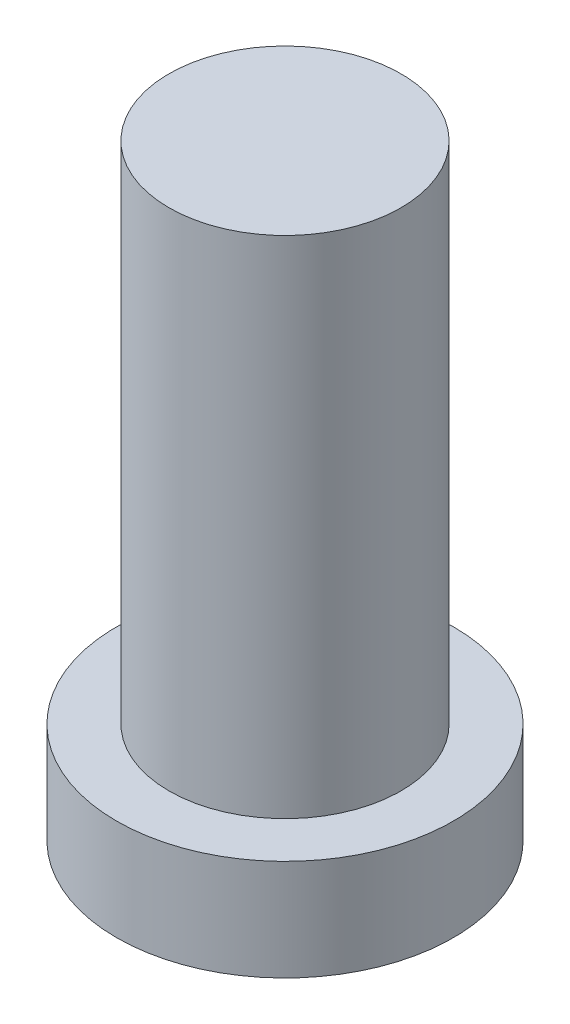
ISO-10303-21;
HEADER;
FILE_DESCRIPTION(('STEP AP214'),'2;1');
FILE_NAME('part.step','',(''),(''),'','','');
FILE_SCHEMA(('AUTOMOTIVE_DESIGN { 1 0 10303 214 1 1 1 1 }'));
ENDSEC;
DATA;
#1=APPLICATION_CONTEXT('core data for automotive mechanical design processes');
#2=APPLICATION_PROTOCOL_DEFINITION('international standard','automotive_design',2000,#1);
#3=PRODUCT_CONTEXT('',#1,'mechanical');
#4=PRODUCT('Part','Part','',(#3));
#5=PRODUCT_RELATED_PRODUCT_CATEGORY('part','',(#4));
#6=PRODUCT_DEFINITION_FORMATION('','',#4);
#7=PRODUCT_DEFINITION_CONTEXT('part definition',#1,'design');
#8=PRODUCT_DEFINITION('design','',#6,#7);
#9=PRODUCT_DEFINITION_SHAPE('','',#8);
#10=(LENGTH_UNIT() NAMED_UNIT(*) SI_UNIT(.MILLI.,.METRE.));
#11=(NAMED_UNIT(*) PLANE_ANGLE_UNIT() SI_UNIT($,.RADIAN.));
#12=(NAMED_UNIT(*) SI_UNIT($,.STERADIAN.) SOLID_ANGLE_UNIT());
#13=UNCERTAINTY_MEASURE_WITH_UNIT(LENGTH_MEASURE(1.E-05),#10,'distance_accuracy_value','');
#14=(GEOMETRIC_REPRESENTATION_CONTEXT(3) GLOBAL_UNCERTAINTY_ASSIGNED_CONTEXT((#13)) GLOBAL_UNIT_ASSIGNED_CONTEXT((#10,
#11,#12)) REPRESENTATION_CONTEXT('',''));
#15=CARTESIAN_POINT('',(0.,0.,0.));
#16=DIRECTION('',(0.,0.,1.));
#17=DIRECTION('',(1.,0.,0.));
#18=AXIS2_PLACEMENT_3D('',#15,#16,#17);
#19=CARTESIAN_POINT('',(0.,30.,0.));
#20=DIRECTION('',(0.,-1.,0.));
#21=DIRECTION('',(0.,0.,-1.));
#22=AXIS2_PLACEMENT_3D('',#19,#20,#21);
#23=CYLINDRICAL_SURFACE('',#22,50.);
#24=CARTESIAN_POINT('',(0.,30.,0.));
#25=DIRECTION('',(0.,1.,0.));
#26=DIRECTION('',(0.,0.,1.));
#27=AXIS2_PLACEMENT_3D('',#24,#25,#26);
#28=CIRCLE('',#27,50.);
#29=CARTESIAN_POINT('',(0.,30.,50.));
#30=VERTEX_POINT('',#29);
#31=EDGE_CURVE('E45',#30,#30,#28,.T.);
#32=ORIENTED_EDGE('',*,*,#31,.F.);
#33=EDGE_LOOP('',(#32));
#34=FACE_BOUND('',#33,.T.);
#35=CARTESIAN_POINT('',(0.,0.,0.));
#36=DIRECTION('',(0.,1.,0.));
#37=DIRECTION('',(0.,0.,1.));
#38=AXIS2_PLACEMENT_3D('',#35,#36,#37);
#39=CIRCLE('',#38,50.);
#40=CARTESIAN_POINT('',(0.,0.,50.));
#41=VERTEX_POINT('',#40);
#42=EDGE_CURVE('E40',#41,#41,#39,.T.);
#43=ORIENTED_EDGE('',*,*,#42,.T.);
#44=EDGE_LOOP('',(#43));
#45=FACE_BOUND('',#44,.T.);
#46=ADVANCED_FACE('F37',(#34,#45),#23,.T.);
#47=CARTESIAN_POINT('',(0.,30.,0.));
#48=DIRECTION('',(0.,1.,0.));
#49=DIRECTION('',(0.,0.,1.));
#50=AXIS2_PLACEMENT_3D('',#47,#48,#49);
#51=PLANE('',#50);
#52=CARTESIAN_POINT('',(0.,30.,0.));
#53=DIRECTION('',(0.,1.,0.));
#54=DIRECTION('',(0.,0.,1.));
#55=AXIS2_PLACEMENT_3D('',#52,#53,#54);
#56=CIRCLE('',#55,34.4660407782263);
#57=CARTESIAN_POINT('',(0.,30.,34.4660407782263));
#58=VERTEX_POINT('',#57);
#59=EDGE_CURVE('E10',#58,#58,#56,.T.);
#60=ORIENTED_EDGE('',*,*,#59,.F.);
#61=EDGE_LOOP('',(#60));
#62=FACE_BOUND('',#61,.T.);
#63=ORIENTED_EDGE('',*,*,#31,.T.);
#64=EDGE_LOOP('',(#63));
#65=FACE_BOUND('',#64,.T.);
#66=ADVANCED_FACE('F65',(#62,#65),#51,.T.);
#67=CARTESIAN_POINT('',(0.,0.,0.));
#68=DIRECTION('',(0.,1.,0.));
#69=DIRECTION('',(0.,0.,1.));
#70=AXIS2_PLACEMENT_3D('',#67,#68,#69);
#71=PLANE('',#70);
#72=ORIENTED_EDGE('',*,*,#42,.F.);
#73=EDGE_LOOP('',(#72));
#74=FACE_BOUND('',#73,.T.);
#75=ADVANCED_FACE('F62',(#74),#71,.F.);
#76=CARTESIAN_POINT('',(0.,180.,0.));
#77=DIRECTION('',(0.,-1.,0.));
#78=DIRECTION('',(0.,0.,-1.));
#79=AXIS2_PLACEMENT_3D('',#76,#77,#78);
#80=CYLINDRICAL_SURFACE('',#79,34.4660407782263);
#81=CARTESIAN_POINT('',(0.,180.,0.));
#82=DIRECTION('',(0.,1.,0.));
#83=DIRECTION('',(0.,0.,1.));
#84=AXIS2_PLACEMENT_3D('',#81,#82,#83);
#85=CIRCLE('',#84,34.4660407782263);
#86=CARTESIAN_POINT('',(0.,180.,34.4660407782263));
#87=VERTEX_POINT('',#86);
#88=EDGE_CURVE('E52',#87,#87,#85,.T.);
#89=ORIENTED_EDGE('',*,*,#88,.F.);
#90=EDGE_LOOP('',(#89));
#91=FACE_BOUND('',#90,.T.);
#92=ORIENTED_EDGE('',*,*,#59,.T.);
#93=EDGE_LOOP('',(#92));
#94=FACE_BOUND('',#93,.T.);
#95=ADVANCED_FACE('F64',(#91,#94),#80,.T.);
#96=CARTESIAN_POINT('',(0.,180.,0.));
#97=DIRECTION('',(0.,1.,0.));
#98=DIRECTION('',(0.,0.,1.));
#99=AXIS2_PLACEMENT_3D('',#96,#97,#98);
#100=PLANE('',#99);
#101=ORIENTED_EDGE('',*,*,#88,.T.);
#102=EDGE_LOOP('',(#101));
#103=FACE_BOUND('',#102,.T.);
#104=ADVANCED_FACE('F70',(#103),#100,.T.);
#105=CLOSED_SHELL('',(#46,#66,#75,#95,#104));
#106=MANIFOLD_SOLID_BREP('B2',#105);
#107=ADVANCED_BREP_SHAPE_REPRESENTATION('',(#18,#106),#14);
#108=SHAPE_DEFINITION_REPRESENTATION(#9,#107);
ENDSEC;
END-ISO-10303-21;
